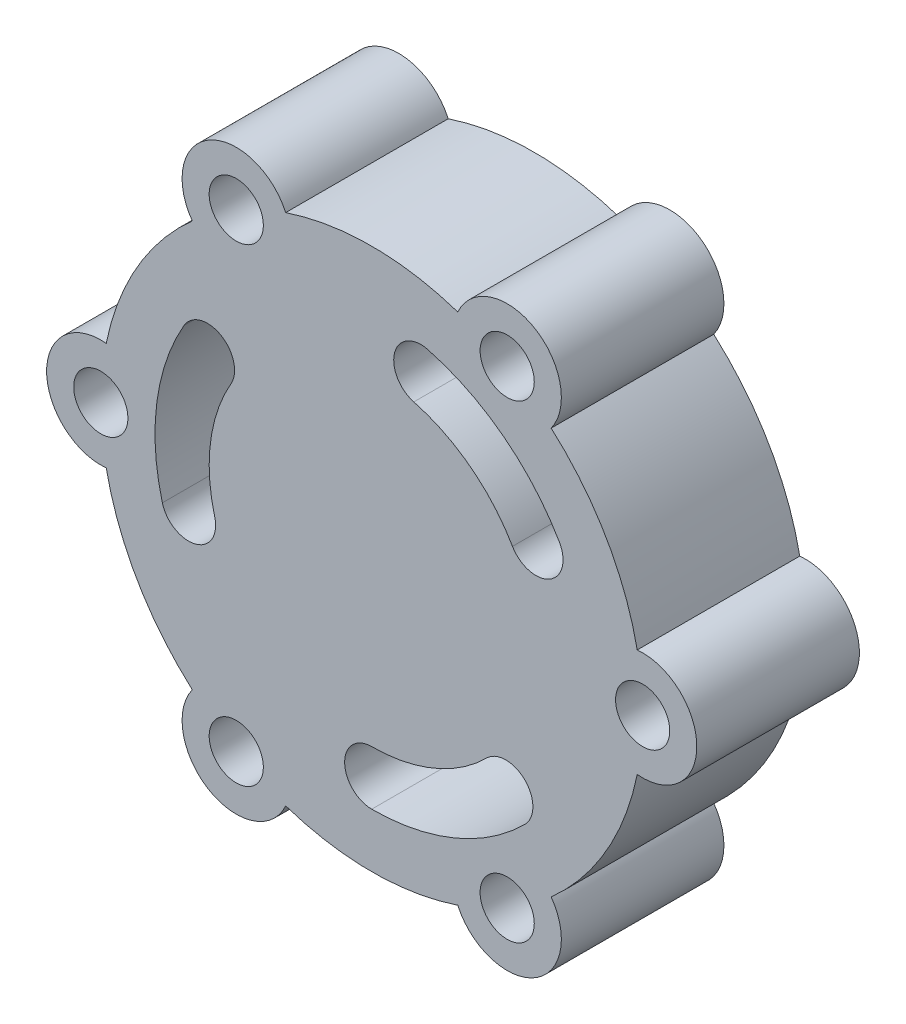
ISO-10303-21;
HEADER;
FILE_DESCRIPTION(('STEP AP214'),'2;1');
FILE_NAME('part.step','',(''),(''),'','','');
FILE_SCHEMA(('AUTOMOTIVE_DESIGN { 1 0 10303 214 1 1 1 1 }'));
ENDSEC;
DATA;
#1=APPLICATION_CONTEXT('core data for automotive mechanical design processes');
#2=APPLICATION_PROTOCOL_DEFINITION('international standard','automotive_design',2000,#1);
#3=PRODUCT_CONTEXT('',#1,'mechanical');
#4=PRODUCT('Part','Part','',(#3));
#5=PRODUCT_RELATED_PRODUCT_CATEGORY('part','',(#4));
#6=PRODUCT_DEFINITION_FORMATION('','',#4);
#7=PRODUCT_DEFINITION_CONTEXT('part definition',#1,'design');
#8=PRODUCT_DEFINITION('design','',#6,#7);
#9=PRODUCT_DEFINITION_SHAPE('','',#8);
#10=(LENGTH_UNIT() NAMED_UNIT(*) SI_UNIT(.MILLI.,.METRE.));
#11=(NAMED_UNIT(*) PLANE_ANGLE_UNIT() SI_UNIT($,.RADIAN.));
#12=(NAMED_UNIT(*) SI_UNIT($,.STERADIAN.) SOLID_ANGLE_UNIT());
#13=UNCERTAINTY_MEASURE_WITH_UNIT(LENGTH_MEASURE(1.E-05),#10,'distance_accuracy_value','');
#14=(GEOMETRIC_REPRESENTATION_CONTEXT(3) GLOBAL_UNCERTAINTY_ASSIGNED_CONTEXT((#13)) GLOBAL_UNIT_ASSIGNED_CONTEXT((#10,
#11,#12)) REPRESENTATION_CONTEXT('',''));
#15=CARTESIAN_POINT('',(0.,0.,0.));
#16=DIRECTION('',(0.,0.,1.));
#17=DIRECTION('',(1.,0.,0.));
#18=AXIS2_PLACEMENT_3D('',#15,#16,#17);
#19=CARTESIAN_POINT('',(45.,70.,30.));
#20=DIRECTION('',(0.,0.,1.));
#21=DIRECTION('',(1.,0.,0.));
#22=AXIS2_PLACEMENT_3D('',#19,#20,#21);
#23=PLANE('',#22);
#24=CARTESIAN_POINT('',(94.9999999999996,113.301270189222,30.));
#25=DIRECTION('',(0.,0.,1.));
#26=DIRECTION('',(1.,0.,0.));
#27=AXIS2_PLACEMENT_3D('',#24,#25,#26);
#28=CIRCLE('',#27,5.);
#29=CARTESIAN_POINT('',(99.9999999999996,113.301270189222,30.));
#30=VERTEX_POINT('',#29);
#31=EDGE_CURVE('E298',#30,#30,#28,.T.);
#32=ORIENTED_EDGE('',*,*,#31,.F.);
#33=EDGE_LOOP('',(#32));
#34=FACE_BOUND('',#33,.T.);
#35=CARTESIAN_POINT('',(95.0000000000002,26.6987298107782,30.));
#36=DIRECTION('',(0.,0.,1.));
#37=DIRECTION('',(1.,0.,0.));
#38=AXIS2_PLACEMENT_3D('',#35,#36,#37);
#39=CIRCLE('',#38,5.);
#40=CARTESIAN_POINT('',(100.,26.6987298107782,30.));
#41=VERTEX_POINT('',#40);
#42=EDGE_CURVE('E310',#41,#41,#39,.T.);
#43=ORIENTED_EDGE('',*,*,#42,.F.);
#44=EDGE_LOOP('',(#43));
#45=FACE_BOUND('',#44,.T.);
#46=CARTESIAN_POINT('',(20.,70.,30.));
#47=DIRECTION('',(0.,0.,1.));
#48=DIRECTION('',(1.,0.,0.));
#49=AXIS2_PLACEMENT_3D('',#46,#47,#48);
#50=CIRCLE('',#49,5.00000000000002);
#51=CARTESIAN_POINT('',(25.,70.,30.));
#52=VERTEX_POINT('',#51);
#53=EDGE_CURVE('E322',#52,#52,#50,.T.);
#54=ORIENTED_EDGE('',*,*,#53,.F.);
#55=EDGE_LOOP('',(#54));
#56=FACE_BOUND('',#55,.T.);
#57=CARTESIAN_POINT('',(20.,70.,30.));
#58=DIRECTION('',(0.,0.,1.));
#59=DIRECTION('',(1.,0.,0.));
#60=AXIS2_PLACEMENT_3D('',#57,#58,#59);
#61=CIRCLE('',#60,10.);
#62=CARTESIAN_POINT('',(21.,79.9498743710662,30.));
#63=VERTEX_POINT('',#62);
#64=CARTESIAN_POINT('',(21.,60.0501256289338,30.));
#65=VERTEX_POINT('',#64);
#66=EDGE_CURVE('E328',#63,#65,#61,.T.);
#67=ORIENTED_EDGE('',*,*,#66,.T.);
#68=CARTESIAN_POINT('',(70.,70.,30.));
#69=DIRECTION('',(0.,0.,1.));
#70=DIRECTION('',(1.,0.,0.));
#71=AXIS2_PLACEMENT_3D('',#68,#69,#70);
#72=CIRCLE('',#71,50.);
#73=CARTESIAN_POINT('',(36.883156030193,32.5396924000955,30.));
#74=VERTEX_POINT('',#73);
#75=EDGE_CURVE('E331',#65,#74,#72,.T.);
#76=ORIENTED_EDGE('',*,*,#75,.T.);
#77=CARTESIAN_POINT('',(45.,26.6987298107781,30.));
#78=DIRECTION('',(0.,0.,1.));
#79=DIRECTION('',(1.,0.,0.));
#80=AXIS2_PLACEMENT_3D('',#77,#78,#79);
#81=CIRCLE('',#80,10.);
#82=CARTESIAN_POINT('',(54.116843969807,22.5898180290294,30.));
#83=VERTEX_POINT('',#82);
#84=EDGE_CURVE('E334',#74,#83,#81,.T.);
#85=ORIENTED_EDGE('',*,*,#84,.T.);
#86=CARTESIAN_POINT('',(70.,70.,30.));
#87=DIRECTION('',(0.,0.,1.));
#88=DIRECTION('',(1.,0.,0.));
#89=AXIS2_PLACEMENT_3D('',#86,#87,#88);
#90=CIRCLE('',#89,50.);
#91=CARTESIAN_POINT('',(85.8831560301931,22.5898180290295,30.));
#92=VERTEX_POINT('',#91);
#93=EDGE_CURVE('E336',#83,#92,#90,.T.);
#94=ORIENTED_EDGE('',*,*,#93,.T.);
#95=CARTESIAN_POINT('',(95.0000000000002,26.6987298107782,30.));
#96=DIRECTION('',(0.,0.,1.));
#97=DIRECTION('',(1.,0.,0.));
#98=AXIS2_PLACEMENT_3D('',#95,#96,#97);
#99=CIRCLE('',#98,10.);
#100=CARTESIAN_POINT('',(103.116843969807,32.5396924000958,30.));
#101=VERTEX_POINT('',#100);
#102=EDGE_CURVE('E338',#92,#101,#99,.T.);
#103=ORIENTED_EDGE('',*,*,#102,.T.);
#104=CARTESIAN_POINT('',(70.,70.,30.));
#105=DIRECTION('',(0.,0.,1.));
#106=DIRECTION('',(1.,0.,0.));
#107=AXIS2_PLACEMENT_3D('',#104,#105,#106);
#108=CIRCLE('',#107,50.);
#109=CARTESIAN_POINT('',(119.,60.0501256289342,30.));
#110=VERTEX_POINT('',#109);
#111=EDGE_CURVE('E340',#101,#110,#108,.T.);
#112=ORIENTED_EDGE('',*,*,#111,.T.);
#113=CARTESIAN_POINT('',(120.,70.0000000000004,30.));
#114=DIRECTION('',(0.,0.,1.));
#115=DIRECTION('',(1.,0.,0.));
#116=AXIS2_PLACEMENT_3D('',#113,#114,#115);
#117=CIRCLE('',#116,10.);
#118=CARTESIAN_POINT('',(119.,79.9498743710666,30.));
#119=VERTEX_POINT('',#118);
#120=EDGE_CURVE('E342',#110,#119,#117,.T.);
#121=ORIENTED_EDGE('',*,*,#120,.T.);
#122=CARTESIAN_POINT('',(70.,70.,30.));
#123=DIRECTION('',(0.,0.,1.));
#124=DIRECTION('',(1.,0.,0.));
#125=AXIS2_PLACEMENT_3D('',#122,#123,#124);
#126=CIRCLE('',#125,50.);
#127=CARTESIAN_POINT('',(103.116843969807,107.460307599905,30.));
#128=VERTEX_POINT('',#127);
#129=EDGE_CURVE('E344',#119,#128,#126,.T.);
#130=ORIENTED_EDGE('',*,*,#129,.T.);
#131=CARTESIAN_POINT('',(94.9999999999996,113.301270189222,30.));
#132=DIRECTION('',(0.,0.,1.));
#133=DIRECTION('',(1.,0.,0.));
#134=AXIS2_PLACEMENT_3D('',#131,#132,#133);
#135=CIRCLE('',#134,10.);
#136=CARTESIAN_POINT('',(85.8831560301925,117.410181970971,30.));
#137=VERTEX_POINT('',#136);
#138=EDGE_CURVE('E346',#128,#137,#135,.T.);
#139=ORIENTED_EDGE('',*,*,#138,.T.);
#140=CARTESIAN_POINT('',(70.,70.,30.));
#141=DIRECTION('',(0.,0.,1.));
#142=DIRECTION('',(1.,0.,0.));
#143=AXIS2_PLACEMENT_3D('',#140,#141,#142);
#144=CIRCLE('',#143,50.);
#145=CARTESIAN_POINT('',(54.1168439698065,117.41018197097,30.));
#146=VERTEX_POINT('',#145);
#147=EDGE_CURVE('E348',#137,#146,#144,.T.);
#148=ORIENTED_EDGE('',*,*,#147,.T.);
#149=CARTESIAN_POINT('',(44.9999999999995,113.301270189222,30.));
#150=DIRECTION('',(0.,0.,1.));
#151=DIRECTION('',(1.,0.,0.));
#152=AXIS2_PLACEMENT_3D('',#149,#150,#151);
#153=CIRCLE('',#152,10.);
#154=CARTESIAN_POINT('',(36.8831560301925,107.460307599904,30.));
#155=VERTEX_POINT('',#154);
#156=EDGE_CURVE('E350',#146,#155,#153,.T.);
#157=ORIENTED_EDGE('',*,*,#156,.T.);
#158=CARTESIAN_POINT('',(70.,70.,30.));
#159=DIRECTION('',(0.,0.,1.));
#160=DIRECTION('',(1.,0.,0.));
#161=AXIS2_PLACEMENT_3D('',#158,#159,#160);
#162=CIRCLE('',#161,50.);
#163=EDGE_CURVE('E352',#155,#63,#162,.T.);
#164=ORIENTED_EDGE('',*,*,#163,.T.);
#165=EDGE_LOOP('',(#67,#76,#85,#94,#103,#112,#121,#130,#139,#148,#157,#164));
#166=FACE_BOUND('',#165,.T.);
#167=CARTESIAN_POINT('',(45.,26.6987298107781,30.));
#168=DIRECTION('',(0.,0.,1.));
#169=DIRECTION('',(1.,0.,0.));
#170=AXIS2_PLACEMENT_3D('',#167,#168,#169);
#171=CIRCLE('',#170,4.99999999999998);
#172=CARTESIAN_POINT('',(50.,26.6987298107781,30.));
#173=VERTEX_POINT('',#172);
#174=EDGE_CURVE('E316',#173,#173,#171,.T.);
#175=ORIENTED_EDGE('',*,*,#174,.F.);
#176=EDGE_LOOP('',(#175));
#177=FACE_BOUND('',#176,.T.);
#178=CARTESIAN_POINT('',(120.,70.0000000000004,30.));
#179=DIRECTION('',(0.,0.,1.));
#180=DIRECTION('',(1.,0.,0.));
#181=AXIS2_PLACEMENT_3D('',#178,#179,#180);
#182=CIRCLE('',#181,5.);
#183=CARTESIAN_POINT('',(125.,70.0000000000004,30.));
#184=VERTEX_POINT('',#183);
#185=EDGE_CURVE('E304',#184,#184,#182,.T.);
#186=ORIENTED_EDGE('',*,*,#185,.F.);
#187=EDGE_LOOP('',(#186));
#188=FACE_BOUND('',#187,.T.);
#189=CARTESIAN_POINT('',(44.9999999999995,113.301270189222,30.));
#190=DIRECTION('',(0.,0.,1.));
#191=DIRECTION('',(1.,0.,0.));
#192=AXIS2_PLACEMENT_3D('',#189,#190,#191);
#193=CIRCLE('',#192,5.00000000000001);
#194=CARTESIAN_POINT('',(49.9999999999995,113.301270189222,30.));
#195=VERTEX_POINT('',#194);
#196=EDGE_CURVE('E292',#195,#195,#193,.T.);
#197=ORIENTED_EDGE('',*,*,#196,.F.);
#198=EDGE_LOOP('',(#197));
#199=FACE_BOUND('',#198,.T.);
#200=CARTESIAN_POINT('',(70.,70.,30.));
#201=DIRECTION('',(0.,0.,1.));
#202=DIRECTION('',(1.,0.,0.));
#203=AXIS2_PLACEMENT_3D('',#200,#201,#202);
#204=CIRCLE('',#203,40.);
#205=CARTESIAN_POINT('',(104.641016151378,89.9999999999998,30.));
#206=VERTEX_POINT('',#205);
#207=CARTESIAN_POINT('',(80.352761804101,108.637033051563,30.));
#208=VERTEX_POINT('',#207);
#209=EDGE_CURVE('E263',#206,#208,#204,.T.);
#210=ORIENTED_EDGE('',*,*,#209,.F.);
#211=CARTESIAN_POINT('',(100.310889132455,87.4999999999998,30.));
#212=DIRECTION('',(0.,0.,1.));
#213=DIRECTION('',(1.,0.,0.));
#214=AXIS2_PLACEMENT_3D('',#211,#212,#213);
#215=CIRCLE('',#214,5.00000000000001);
#216=CARTESIAN_POINT('',(95.9807621135332,84.9999999999998,30.));
#217=VERTEX_POINT('',#216);
#218=EDGE_CURVE('E261',#217,#206,#215,.T.);
#219=ORIENTED_EDGE('',*,*,#218,.F.);
#220=CARTESIAN_POINT('',(70.,70.,30.));
#221=DIRECTION('',(0.,0.,-1.));
#222=DIRECTION('',(1.,0.,0.));
#223=AXIS2_PLACEMENT_3D('',#220,#221,#222);
#224=CIRCLE('',#223,30.);
#225=CARTESIAN_POINT('',(77.7645713530757,98.977774788672,30.));
#226=VERTEX_POINT('',#225);
#227=EDGE_CURVE('E269',#226,#217,#224,.T.);
#228=ORIENTED_EDGE('',*,*,#227,.F.);
#229=CARTESIAN_POINT('',(79.0586665785884,103.807403920117,30.));
#230=DIRECTION('',(0.,0.,1.));
#231=DIRECTION('',(1.,0.,0.));
#232=AXIS2_PLACEMENT_3D('',#229,#230,#231);
#233=CIRCLE('',#232,5.);
#234=EDGE_CURVE('E266',#208,#226,#233,.T.);
#235=ORIENTED_EDGE('',*,*,#234,.F.);
#236=EDGE_LOOP('',(#210,#219,#228,#235));
#237=FACE_BOUND('',#236,.T.);
#238=CARTESIAN_POINT('',(70.,70.,30.));
#239=DIRECTION('',(0.,0.,1.));
#240=DIRECTION('',(1.,0.,0.));
#241=AXIS2_PLACEMENT_3D('',#238,#239,#240);
#242=CIRCLE('',#241,40.);
#243=CARTESIAN_POINT('',(69.9999999999998,30.,30.));
#244=VERTEX_POINT('',#243);
#245=CARTESIAN_POINT('',(98.2842712474617,41.7157287525379,30.));
#246=VERTEX_POINT('',#245);
#247=EDGE_CURVE('E232',#244,#246,#242,.T.);
#248=ORIENTED_EDGE('',*,*,#247,.F.);
#249=CARTESIAN_POINT('',(69.9999999999998,35.,30.));
#250=DIRECTION('',(0.,0.,1.));
#251=DIRECTION('',(1.,0.,0.));
#252=AXIS2_PLACEMENT_3D('',#249,#250,#251);
#253=CIRCLE('',#252,5.);
#254=CARTESIAN_POINT('',(69.9999999999998,40.,30.));
#255=VERTEX_POINT('',#254);
#256=EDGE_CURVE('E230',#255,#244,#253,.T.);
#257=ORIENTED_EDGE('',*,*,#256,.F.);
#258=CARTESIAN_POINT('',(70.,70.,30.));
#259=DIRECTION('',(0.,0.,-1.));
#260=DIRECTION('',(1.,0.,0.));
#261=AXIS2_PLACEMENT_3D('',#258,#259,#260);
#262=CIRCLE('',#261,30.);
#263=CARTESIAN_POINT('',(91.2132034355963,48.7867965644035,30.));
#264=VERTEX_POINT('',#263);
#265=EDGE_CURVE('E238',#264,#255,#262,.T.);
#266=ORIENTED_EDGE('',*,*,#265,.F.);
#267=CARTESIAN_POINT('',(94.748737341529,45.2512626584707,30.));
#268=DIRECTION('',(0.,0.,1.));
#269=DIRECTION('',(1.,0.,0.));
#270=AXIS2_PLACEMENT_3D('',#267,#268,#269);
#271=CIRCLE('',#270,5.);
#272=EDGE_CURVE('E235',#246,#264,#271,.T.);
#273=ORIENTED_EDGE('',*,*,#272,.F.);
#274=EDGE_LOOP('',(#248,#257,#266,#273));
#275=FACE_BOUND('',#274,.T.);
#276=CARTESIAN_POINT('',(70.,70.,30.));
#277=DIRECTION('',(0.,0.,1.));
#278=DIRECTION('',(1.,0.,0.));
#279=AXIS2_PLACEMENT_3D('',#276,#277,#278);
#280=CIRCLE('',#279,40.);
#281=CARTESIAN_POINT('',(35.3589838486226,90.0000000000002,30.));
#282=VERTEX_POINT('',#281);
#283=CARTESIAN_POINT('',(31.3629669484372,59.6472381958993,30.));
#284=VERTEX_POINT('',#283);
#285=EDGE_CURVE('E202',#282,#284,#280,.T.);
#286=ORIENTED_EDGE('',*,*,#285,.F.);
#287=CARTESIAN_POINT('',(39.6891108675447,87.5000000000002,30.));
#288=DIRECTION('',(0.,0.,1.));
#289=DIRECTION('',(1.,0.,0.));
#290=AXIS2_PLACEMENT_3D('',#287,#288,#289);
#291=CIRCLE('',#290,5.);
#292=CARTESIAN_POINT('',(44.0192378864669,85.0000000000002,30.));
#293=VERTEX_POINT('',#292);
#294=EDGE_CURVE('E194',#293,#282,#291,.T.);
#295=ORIENTED_EDGE('',*,*,#294,.F.);
#296=CARTESIAN_POINT('',(70.,70.,30.));
#297=DIRECTION('',(0.,0.,-1.));
#298=DIRECTION('',(1.,0.,0.));
#299=AXIS2_PLACEMENT_3D('',#296,#297,#298);
#300=CIRCLE('',#299,30.);
#301=CARTESIAN_POINT('',(41.0222252113279,62.2354286469245,30.));
#302=VERTEX_POINT('',#301);
#303=EDGE_CURVE('E216',#302,#293,#300,.T.);
#304=ORIENTED_EDGE('',*,*,#303,.F.);
#305=CARTESIAN_POINT('',(36.1925960798825,60.9413334214119,30.));
#306=DIRECTION('',(0.,0.,1.));
#307=DIRECTION('',(1.,0.,0.));
#308=AXIS2_PLACEMENT_3D('',#305,#306,#307);
#309=CIRCLE('',#308,5.00000000000001);
#310=EDGE_CURVE('E214',#284,#302,#309,.T.);
#311=ORIENTED_EDGE('',*,*,#310,.F.);
#312=EDGE_LOOP('',(#286,#295,#304,#311));
#313=FACE_BOUND('',#312,.T.);
#314=ADVANCED_FACE('F33',(#34,#45,#56,#166,#177,#188,#199,#237,#275,#313),#23,.T.);
#315=CARTESIAN_POINT('',(45.,70.,0.));
#316=DIRECTION('',(0.,0.,1.));
#317=DIRECTION('',(1.,0.,0.));
#318=AXIS2_PLACEMENT_3D('',#315,#316,#317);
#319=PLANE('',#318);
#320=CARTESIAN_POINT('',(69.9999999999998,35.,0.));
#321=DIRECTION('',(0.,0.,1.));
#322=DIRECTION('',(1.,0.,0.));
#323=AXIS2_PLACEMENT_3D('',#320,#321,#322);
#324=CIRCLE('',#323,5.);
#325=CARTESIAN_POINT('',(69.9999999999998,40.,0.));
#326=VERTEX_POINT('',#325);
#327=CARTESIAN_POINT('',(69.9999999999998,30.,0.));
#328=VERTEX_POINT('',#327);
#329=EDGE_CURVE('E210',#326,#328,#324,.T.);
#330=ORIENTED_EDGE('',*,*,#329,.T.);
#331=CARTESIAN_POINT('',(70.,70.,0.));
#332=DIRECTION('',(0.,0.,1.));
#333=DIRECTION('',(1.,0.,0.));
#334=AXIS2_PLACEMENT_3D('',#331,#332,#333);
#335=CIRCLE('',#334,40.);
#336=CARTESIAN_POINT('',(98.2842712474617,41.7157287525379,0.));
#337=VERTEX_POINT('',#336);
#338=EDGE_CURVE('E243',#328,#337,#335,.T.);
#339=ORIENTED_EDGE('',*,*,#338,.T.);
#340=CARTESIAN_POINT('',(94.748737341529,45.2512626584707,0.));
#341=DIRECTION('',(0.,0.,1.));
#342=DIRECTION('',(1.,0.,0.));
#343=AXIS2_PLACEMENT_3D('',#340,#341,#342);
#344=CIRCLE('',#343,5.);
#345=CARTESIAN_POINT('',(91.2132034355963,48.7867965644035,0.));
#346=VERTEX_POINT('',#345);
#347=EDGE_CURVE('E246',#337,#346,#344,.T.);
#348=ORIENTED_EDGE('',*,*,#347,.T.);
#349=CARTESIAN_POINT('',(70.,70.,0.));
#350=DIRECTION('',(0.,0.,-1.));
#351=DIRECTION('',(1.,0.,0.));
#352=AXIS2_PLACEMENT_3D('',#349,#350,#351);
#353=CIRCLE('',#352,30.);
#354=EDGE_CURVE('E233',#346,#326,#353,.T.);
#355=ORIENTED_EDGE('',*,*,#354,.T.);
#356=EDGE_LOOP('',(#330,#339,#348,#355));
#357=FACE_BOUND('',#356,.T.);
#358=CARTESIAN_POINT('',(44.9999999999995,113.301270189222,0.));
#359=DIRECTION('',(0.,0.,1.));
#360=DIRECTION('',(1.,0.,0.));
#361=AXIS2_PLACEMENT_3D('',#358,#359,#360);
#362=CIRCLE('',#361,5.00000000000001);
#363=CARTESIAN_POINT('',(49.9999999999995,113.301270189222,0.));
#364=VERTEX_POINT('',#363);
#365=EDGE_CURVE('E291',#364,#364,#362,.T.);
#366=ORIENTED_EDGE('',*,*,#365,.T.);
#367=EDGE_LOOP('',(#366));
#368=FACE_BOUND('',#367,.T.);
#369=CARTESIAN_POINT('',(94.9999999999996,113.301270189222,0.));
#370=DIRECTION('',(0.,0.,1.));
#371=DIRECTION('',(1.,0.,0.));
#372=AXIS2_PLACEMENT_3D('',#369,#370,#371);
#373=CIRCLE('',#372,5.);
#374=CARTESIAN_POINT('',(99.9999999999996,113.301270189222,0.));
#375=VERTEX_POINT('',#374);
#376=EDGE_CURVE('E295',#375,#375,#373,.T.);
#377=ORIENTED_EDGE('',*,*,#376,.T.);
#378=EDGE_LOOP('',(#377));
#379=FACE_BOUND('',#378,.T.);
#380=CARTESIAN_POINT('',(120.,70.0000000000004,0.));
#381=DIRECTION('',(0.,0.,1.));
#382=DIRECTION('',(1.,0.,0.));
#383=AXIS2_PLACEMENT_3D('',#380,#381,#382);
#384=CIRCLE('',#383,5.);
#385=CARTESIAN_POINT('',(125.,70.0000000000004,0.));
#386=VERTEX_POINT('',#385);
#387=EDGE_CURVE('E301',#386,#386,#384,.T.);
#388=ORIENTED_EDGE('',*,*,#387,.T.);
#389=EDGE_LOOP('',(#388));
#390=FACE_BOUND('',#389,.T.);
#391=CARTESIAN_POINT('',(95.0000000000002,26.6987298107782,0.));
#392=DIRECTION('',(0.,0.,1.));
#393=DIRECTION('',(1.,0.,0.));
#394=AXIS2_PLACEMENT_3D('',#391,#392,#393);
#395=CIRCLE('',#394,5.);
#396=CARTESIAN_POINT('',(100.,26.6987298107782,0.));
#397=VERTEX_POINT('',#396);
#398=EDGE_CURVE('E307',#397,#397,#395,.T.);
#399=ORIENTED_EDGE('',*,*,#398,.T.);
#400=EDGE_LOOP('',(#399));
#401=FACE_BOUND('',#400,.T.);
#402=CARTESIAN_POINT('',(45.,26.6987298107781,0.));
#403=DIRECTION('',(0.,0.,1.));
#404=DIRECTION('',(1.,0.,0.));
#405=AXIS2_PLACEMENT_3D('',#402,#403,#404);
#406=CIRCLE('',#405,4.99999999999998);
#407=CARTESIAN_POINT('',(50.,26.6987298107781,0.));
#408=VERTEX_POINT('',#407);
#409=EDGE_CURVE('E313',#408,#408,#406,.T.);
#410=ORIENTED_EDGE('',*,*,#409,.T.);
#411=EDGE_LOOP('',(#410));
#412=FACE_BOUND('',#411,.T.);
#413=CARTESIAN_POINT('',(20.,70.,0.));
#414=DIRECTION('',(0.,0.,1.));
#415=DIRECTION('',(1.,0.,0.));
#416=AXIS2_PLACEMENT_3D('',#413,#414,#415);
#417=CIRCLE('',#416,5.00000000000002);
#418=CARTESIAN_POINT('',(25.,70.,0.));
#419=VERTEX_POINT('',#418);
#420=EDGE_CURVE('E319',#419,#419,#417,.T.);
#421=ORIENTED_EDGE('',*,*,#420,.T.);
#422=EDGE_LOOP('',(#421));
#423=FACE_BOUND('',#422,.T.);
#424=CARTESIAN_POINT('',(20.,70.,0.));
#425=DIRECTION('',(0.,0.,1.));
#426=DIRECTION('',(1.,0.,0.));
#427=AXIS2_PLACEMENT_3D('',#424,#425,#426);
#428=CIRCLE('',#427,10.);
#429=CARTESIAN_POINT('',(21.,79.9498743710662,0.));
#430=VERTEX_POINT('',#429);
#431=CARTESIAN_POINT('',(21.,60.0501256289338,0.));
#432=VERTEX_POINT('',#431);
#433=EDGE_CURVE('E325',#430,#432,#428,.T.);
#434=ORIENTED_EDGE('',*,*,#433,.F.);
#435=CARTESIAN_POINT('',(70.,70.,0.));
#436=DIRECTION('',(0.,0.,1.));
#437=DIRECTION('',(1.,0.,0.));
#438=AXIS2_PLACEMENT_3D('',#435,#436,#437);
#439=CIRCLE('',#438,50.);
#440=CARTESIAN_POINT('',(36.8831560301925,107.460307599904,0.));
#441=VERTEX_POINT('',#440);
#442=EDGE_CURVE('E332',#441,#430,#439,.T.);
#443=ORIENTED_EDGE('',*,*,#442,.F.);
#444=CARTESIAN_POINT('',(44.9999999999995,113.301270189222,0.));
#445=DIRECTION('',(0.,0.,1.));
#446=DIRECTION('',(1.,0.,0.));
#447=AXIS2_PLACEMENT_3D('',#444,#445,#446);
#448=CIRCLE('',#447,10.);
#449=CARTESIAN_POINT('',(54.1168439698065,117.41018197097,0.));
#450=VERTEX_POINT('',#449);
#451=EDGE_CURVE('E375',#450,#441,#448,.T.);
#452=ORIENTED_EDGE('',*,*,#451,.F.);
#453=CARTESIAN_POINT('',(70.,70.,0.));
#454=DIRECTION('',(0.,0.,1.));
#455=DIRECTION('',(1.,0.,0.));
#456=AXIS2_PLACEMENT_3D('',#453,#454,#455);
#457=CIRCLE('',#456,50.);
#458=CARTESIAN_POINT('',(85.8831560301925,117.410181970971,0.));
#459=VERTEX_POINT('',#458);
#460=EDGE_CURVE('E373',#459,#450,#457,.T.);
#461=ORIENTED_EDGE('',*,*,#460,.F.);
#462=CARTESIAN_POINT('',(94.9999999999996,113.301270189222,0.));
#463=DIRECTION('',(0.,0.,1.));
#464=DIRECTION('',(1.,0.,0.));
#465=AXIS2_PLACEMENT_3D('',#462,#463,#464);
#466=CIRCLE('',#465,10.);
#467=CARTESIAN_POINT('',(103.116843969807,107.460307599905,0.));
#468=VERTEX_POINT('',#467);
#469=EDGE_CURVE('E371',#468,#459,#466,.T.);
#470=ORIENTED_EDGE('',*,*,#469,.F.);
#471=CARTESIAN_POINT('',(70.,70.,0.));
#472=DIRECTION('',(0.,0.,1.));
#473=DIRECTION('',(1.,0.,0.));
#474=AXIS2_PLACEMENT_3D('',#471,#472,#473);
#475=CIRCLE('',#474,50.);
#476=CARTESIAN_POINT('',(119.,79.9498743710666,0.));
#477=VERTEX_POINT('',#476);
#478=EDGE_CURVE('E369',#477,#468,#475,.T.);
#479=ORIENTED_EDGE('',*,*,#478,.F.);
#480=CARTESIAN_POINT('',(120.,70.0000000000004,0.));
#481=DIRECTION('',(0.,0.,1.));
#482=DIRECTION('',(1.,0.,0.));
#483=AXIS2_PLACEMENT_3D('',#480,#481,#482);
#484=CIRCLE('',#483,10.);
#485=CARTESIAN_POINT('',(119.,60.0501256289342,0.));
#486=VERTEX_POINT('',#485);
#487=EDGE_CURVE('E367',#486,#477,#484,.T.);
#488=ORIENTED_EDGE('',*,*,#487,.F.);
#489=CARTESIAN_POINT('',(70.,70.,0.));
#490=DIRECTION('',(0.,0.,1.));
#491=DIRECTION('',(1.,0.,0.));
#492=AXIS2_PLACEMENT_3D('',#489,#490,#491);
#493=CIRCLE('',#492,50.);
#494=CARTESIAN_POINT('',(103.116843969807,32.5396924000958,0.));
#495=VERTEX_POINT('',#494);
#496=EDGE_CURVE('E365',#495,#486,#493,.T.);
#497=ORIENTED_EDGE('',*,*,#496,.F.);
#498=CARTESIAN_POINT('',(95.0000000000002,26.6987298107782,0.));
#499=DIRECTION('',(0.,0.,1.));
#500=DIRECTION('',(1.,0.,0.));
#501=AXIS2_PLACEMENT_3D('',#498,#499,#500);
#502=CIRCLE('',#501,10.);
#503=CARTESIAN_POINT('',(85.8831560301931,22.5898180290295,0.));
#504=VERTEX_POINT('',#503);
#505=EDGE_CURVE('E363',#504,#495,#502,.T.);
#506=ORIENTED_EDGE('',*,*,#505,.F.);
#507=CARTESIAN_POINT('',(70.,70.,0.));
#508=DIRECTION('',(0.,0.,1.));
#509=DIRECTION('',(1.,0.,0.));
#510=AXIS2_PLACEMENT_3D('',#507,#508,#509);
#511=CIRCLE('',#510,50.);
#512=CARTESIAN_POINT('',(54.116843969807,22.5898180290294,0.));
#513=VERTEX_POINT('',#512);
#514=EDGE_CURVE('E361',#513,#504,#511,.T.);
#515=ORIENTED_EDGE('',*,*,#514,.F.);
#516=CARTESIAN_POINT('',(45.,26.6987298107781,0.));
#517=DIRECTION('',(0.,0.,1.));
#518=DIRECTION('',(1.,0.,0.));
#519=AXIS2_PLACEMENT_3D('',#516,#517,#518);
#520=CIRCLE('',#519,10.);
#521=CARTESIAN_POINT('',(36.883156030193,32.5396924000955,0.));
#522=VERTEX_POINT('',#521);
#523=EDGE_CURVE('E359',#522,#513,#520,.T.);
#524=ORIENTED_EDGE('',*,*,#523,.F.);
#525=CARTESIAN_POINT('',(70.,70.,0.));
#526=DIRECTION('',(0.,0.,1.));
#527=DIRECTION('',(1.,0.,0.));
#528=AXIS2_PLACEMENT_3D('',#525,#526,#527);
#529=CIRCLE('',#528,50.);
#530=EDGE_CURVE('E357',#432,#522,#529,.T.);
#531=ORIENTED_EDGE('',*,*,#530,.F.);
#532=EDGE_LOOP('',(#434,#443,#452,#461,#470,#479,#488,#497,#506,#515,#524,#531));
#533=FACE_BOUND('',#532,.T.);
#534=CARTESIAN_POINT('',(100.310889132455,87.4999999999998,0.));
#535=DIRECTION('',(0.,0.,1.));
#536=DIRECTION('',(1.,0.,0.));
#537=AXIS2_PLACEMENT_3D('',#534,#535,#536);
#538=CIRCLE('',#537,5.00000000000001);
#539=CARTESIAN_POINT('',(95.9807621135332,84.9999999999998,0.));
#540=VERTEX_POINT('',#539);
#541=CARTESIAN_POINT('',(104.641016151378,89.9999999999998,0.));
#542=VERTEX_POINT('',#541);
#543=EDGE_CURVE('E260',#540,#542,#538,.T.);
#544=ORIENTED_EDGE('',*,*,#543,.T.);
#545=CARTESIAN_POINT('',(70.,70.,0.));
#546=DIRECTION('',(0.,0.,1.));
#547=DIRECTION('',(1.,0.,0.));
#548=AXIS2_PLACEMENT_3D('',#545,#546,#547);
#549=CIRCLE('',#548,40.);
#550=CARTESIAN_POINT('',(80.352761804101,108.637033051563,0.));
#551=VERTEX_POINT('',#550);
#552=EDGE_CURVE('E274',#542,#551,#549,.T.);
#553=ORIENTED_EDGE('',*,*,#552,.T.);
#554=CARTESIAN_POINT('',(79.0586665785884,103.807403920117,0.));
#555=DIRECTION('',(0.,0.,1.));
#556=DIRECTION('',(1.,0.,0.));
#557=AXIS2_PLACEMENT_3D('',#554,#555,#556);
#558=CIRCLE('',#557,5.);
#559=CARTESIAN_POINT('',(77.7645713530757,98.977774788672,0.));
#560=VERTEX_POINT('',#559);
#561=EDGE_CURVE('E277',#551,#560,#558,.T.);
#562=ORIENTED_EDGE('',*,*,#561,.T.);
#563=CARTESIAN_POINT('',(70.,70.,0.));
#564=DIRECTION('',(0.,0.,-1.));
#565=DIRECTION('',(1.,0.,0.));
#566=AXIS2_PLACEMENT_3D('',#563,#564,#565);
#567=CIRCLE('',#566,30.);
#568=EDGE_CURVE('E264',#560,#540,#567,.T.);
#569=ORIENTED_EDGE('',*,*,#568,.T.);
#570=EDGE_LOOP('',(#544,#553,#562,#569));
#571=FACE_BOUND('',#570,.T.);
#572=CARTESIAN_POINT('',(39.6891108675447,87.5000000000002,0.));
#573=DIRECTION('',(0.,0.,1.));
#574=DIRECTION('',(1.,0.,0.));
#575=AXIS2_PLACEMENT_3D('',#572,#573,#574);
#576=CIRCLE('',#575,5.);
#577=CARTESIAN_POINT('',(44.0192378864669,85.0000000000002,0.));
#578=VERTEX_POINT('',#577);
#579=CARTESIAN_POINT('',(35.3589838486226,90.0000000000002,0.));
#580=VERTEX_POINT('',#579);
#581=EDGE_CURVE('E56',#578,#580,#576,.T.);
#582=ORIENTED_EDGE('',*,*,#581,.T.);
#583=CARTESIAN_POINT('',(70.,70.,0.));
#584=DIRECTION('',(0.,0.,1.));
#585=DIRECTION('',(1.,0.,0.));
#586=AXIS2_PLACEMENT_3D('',#583,#584,#585);
#587=CIRCLE('',#586,40.);
#588=CARTESIAN_POINT('',(31.3629669484372,59.6472381958993,0.));
#589=VERTEX_POINT('',#588);
#590=EDGE_CURVE('E209',#580,#589,#587,.T.);
#591=ORIENTED_EDGE('',*,*,#590,.T.);
#592=CARTESIAN_POINT('',(36.1925960798825,60.9413334214119,0.));
#593=DIRECTION('',(0.,0.,1.));
#594=DIRECTION('',(1.,0.,0.));
#595=AXIS2_PLACEMENT_3D('',#592,#593,#594);
#596=CIRCLE('',#595,5.00000000000001);
#597=CARTESIAN_POINT('',(41.0222252113279,62.2354286469245,0.));
#598=VERTEX_POINT('',#597);
#599=EDGE_CURVE('E222',#589,#598,#596,.T.);
#600=ORIENTED_EDGE('',*,*,#599,.T.);
#601=CARTESIAN_POINT('',(70.,70.,0.));
#602=DIRECTION('',(0.,0.,-1.));
#603=DIRECTION('',(1.,0.,0.));
#604=AXIS2_PLACEMENT_3D('',#601,#602,#603);
#605=CIRCLE('',#604,30.);
#606=EDGE_CURVE('E203',#598,#578,#605,.T.);
#607=ORIENTED_EDGE('',*,*,#606,.T.);
#608=EDGE_LOOP('',(#582,#591,#600,#607));
#609=FACE_BOUND('',#608,.T.);
#610=ADVANCED_FACE('F417',(#357,#368,#379,#390,#401,#412,#423,#533,#571,#609),#319,.F.);
#611=CARTESIAN_POINT('',(20.,70.,30.));
#612=DIRECTION('',(0.,0.,-1.));
#613=DIRECTION('',(-1.,0.,0.));
#614=AXIS2_PLACEMENT_3D('',#611,#612,#613);
#615=CYLINDRICAL_SURFACE('',#614,10.);
#616=ORIENTED_EDGE('',*,*,#433,.T.);
#617=DIRECTION('',(0.,0.,-1.));
#618=VECTOR('',#617,1.);
#619=CARTESIAN_POINT('',(21.,60.0501256289338,30.));
#620=LINE('',#619,#618);
#621=EDGE_CURVE('E11',#65,#432,#620,.T.);
#622=ORIENTED_EDGE('',*,*,#621,.F.);
#623=ORIENTED_EDGE('',*,*,#66,.F.);
#624=DIRECTION('',(0.,0.,-1.));
#625=VECTOR('',#624,1.);
#626=CARTESIAN_POINT('',(21.,79.9498743710662,30.));
#627=LINE('',#626,#625);
#628=EDGE_CURVE('E354',#63,#430,#627,.T.);
#629=ORIENTED_EDGE('',*,*,#628,.T.);
#630=EDGE_LOOP('',(#616,#622,#623,#629));
#631=FACE_BOUND('',#630,.T.);
#632=ADVANCED_FACE('F35',(#631),#615,.T.);
#633=CARTESIAN_POINT('',(70.,70.,30.));
#634=DIRECTION('',(0.,0.,-1.));
#635=DIRECTION('',(-1.,0.,0.));
#636=AXIS2_PLACEMENT_3D('',#633,#634,#635);
#637=CYLINDRICAL_SURFACE('',#636,50.);
#638=ORIENTED_EDGE('',*,*,#530,.T.);
#639=DIRECTION('',(0.,0.,-1.));
#640=VECTOR('',#639,1.);
#641=CARTESIAN_POINT('',(36.883156030193,32.5396924000955,30.));
#642=LINE('',#641,#640);
#643=EDGE_CURVE('E41',#74,#522,#642,.T.);
#644=ORIENTED_EDGE('',*,*,#643,.F.);
#645=ORIENTED_EDGE('',*,*,#75,.F.);
#646=ORIENTED_EDGE('',*,*,#621,.T.);
#647=EDGE_LOOP('',(#638,#644,#645,#646));
#648=FACE_BOUND('',#647,.T.);
#649=ADVANCED_FACE('F435',(#648),#637,.T.);
#650=CARTESIAN_POINT('',(45.,26.6987298107781,30.));
#651=DIRECTION('',(0.,0.,-1.));
#652=DIRECTION('',(-1.,0.,0.));
#653=AXIS2_PLACEMENT_3D('',#650,#651,#652);
#654=CYLINDRICAL_SURFACE('',#653,10.);
#655=ORIENTED_EDGE('',*,*,#523,.T.);
#656=DIRECTION('',(0.,0.,-1.));
#657=VECTOR('',#656,1.);
#658=CARTESIAN_POINT('',(54.116843969807,22.5898180290294,30.));
#659=LINE('',#658,#657);
#660=EDGE_CURVE('E404',#83,#513,#659,.T.);
#661=ORIENTED_EDGE('',*,*,#660,.F.);
#662=ORIENTED_EDGE('',*,*,#84,.F.);
#663=ORIENTED_EDGE('',*,*,#643,.T.);
#664=EDGE_LOOP('',(#655,#661,#662,#663));
#665=FACE_BOUND('',#664,.T.);
#666=ADVANCED_FACE('F411',(#665),#654,.T.);
#667=CARTESIAN_POINT('',(70.,70.,30.));
#668=DIRECTION('',(0.,0.,-1.));
#669=DIRECTION('',(-1.,0.,0.));
#670=AXIS2_PLACEMENT_3D('',#667,#668,#669);
#671=CYLINDRICAL_SURFACE('',#670,50.);
#672=ORIENTED_EDGE('',*,*,#514,.T.);
#673=DIRECTION('',(0.,0.,-1.));
#674=VECTOR('',#673,1.);
#675=CARTESIAN_POINT('',(85.8831560301931,22.5898180290295,30.));
#676=LINE('',#675,#674);
#677=EDGE_CURVE('E401',#92,#504,#676,.T.);
#678=ORIENTED_EDGE('',*,*,#677,.F.);
#679=ORIENTED_EDGE('',*,*,#93,.F.);
#680=ORIENTED_EDGE('',*,*,#660,.T.);
#681=EDGE_LOOP('',(#672,#678,#679,#680));
#682=FACE_BOUND('',#681,.T.);
#683=ADVANCED_FACE('F423',(#682),#671,.T.);
#684=CARTESIAN_POINT('',(95.0000000000002,26.6987298107782,30.));
#685=DIRECTION('',(0.,0.,-1.));
#686=DIRECTION('',(-1.,0.,0.));
#687=AXIS2_PLACEMENT_3D('',#684,#685,#686);
#688=CYLINDRICAL_SURFACE('',#687,10.);
#689=ORIENTED_EDGE('',*,*,#505,.T.);
#690=DIRECTION('',(0.,0.,-1.));
#691=VECTOR('',#690,1.);
#692=CARTESIAN_POINT('',(103.116843969807,32.5396924000958,30.));
#693=LINE('',#692,#691);
#694=EDGE_CURVE('E398',#101,#495,#693,.T.);
#695=ORIENTED_EDGE('',*,*,#694,.F.);
#696=ORIENTED_EDGE('',*,*,#102,.F.);
#697=ORIENTED_EDGE('',*,*,#677,.T.);
#698=EDGE_LOOP('',(#689,#695,#696,#697));
#699=FACE_BOUND('',#698,.T.);
#700=ADVANCED_FACE('F427',(#699),#688,.T.);
#701=CARTESIAN_POINT('',(70.,70.,30.));
#702=DIRECTION('',(0.,0.,-1.));
#703=DIRECTION('',(-1.,0.,0.));
#704=AXIS2_PLACEMENT_3D('',#701,#702,#703);
#705=CYLINDRICAL_SURFACE('',#704,50.);
#706=ORIENTED_EDGE('',*,*,#496,.T.);
#707=DIRECTION('',(0.,0.,-1.));
#708=VECTOR('',#707,1.);
#709=CARTESIAN_POINT('',(119.,60.0501256289342,30.));
#710=LINE('',#709,#708);
#711=EDGE_CURVE('E395',#110,#486,#710,.T.);
#712=ORIENTED_EDGE('',*,*,#711,.F.);
#713=ORIENTED_EDGE('',*,*,#111,.F.);
#714=ORIENTED_EDGE('',*,*,#694,.T.);
#715=EDGE_LOOP('',(#706,#712,#713,#714));
#716=FACE_BOUND('',#715,.T.);
#717=ADVANCED_FACE('F468',(#716),#705,.T.);
#718=CARTESIAN_POINT('',(120.,70.0000000000004,30.));
#719=DIRECTION('',(0.,0.,-1.));
#720=DIRECTION('',(-1.,0.,0.));
#721=AXIS2_PLACEMENT_3D('',#718,#719,#720);
#722=CYLINDRICAL_SURFACE('',#721,10.);
#723=ORIENTED_EDGE('',*,*,#487,.T.);
#724=DIRECTION('',(0.,0.,-1.));
#725=VECTOR('',#724,1.);
#726=CARTESIAN_POINT('',(119.,79.9498743710666,30.));
#727=LINE('',#726,#725);
#728=EDGE_CURVE('E392',#119,#477,#727,.T.);
#729=ORIENTED_EDGE('',*,*,#728,.F.);
#730=ORIENTED_EDGE('',*,*,#120,.F.);
#731=ORIENTED_EDGE('',*,*,#711,.T.);
#732=EDGE_LOOP('',(#723,#729,#730,#731));
#733=FACE_BOUND('',#732,.T.);
#734=ADVANCED_FACE('F466',(#733),#722,.T.);
#735=CARTESIAN_POINT('',(70.,70.,30.));
#736=DIRECTION('',(0.,0.,-1.));
#737=DIRECTION('',(-1.,0.,0.));
#738=AXIS2_PLACEMENT_3D('',#735,#736,#737);
#739=CYLINDRICAL_SURFACE('',#738,50.);
#740=ORIENTED_EDGE('',*,*,#478,.T.);
#741=DIRECTION('',(0.,0.,-1.));
#742=VECTOR('',#741,1.);
#743=CARTESIAN_POINT('',(103.116843969807,107.460307599905,30.));
#744=LINE('',#743,#742);
#745=EDGE_CURVE('E389',#128,#468,#744,.T.);
#746=ORIENTED_EDGE('',*,*,#745,.F.);
#747=ORIENTED_EDGE('',*,*,#129,.F.);
#748=ORIENTED_EDGE('',*,*,#728,.T.);
#749=EDGE_LOOP('',(#740,#746,#747,#748));
#750=FACE_BOUND('',#749,.T.);
#751=ADVANCED_FACE('F462',(#750),#739,.T.);
#752=CARTESIAN_POINT('',(94.9999999999996,113.301270189222,30.));
#753=DIRECTION('',(0.,0.,-1.));
#754=DIRECTION('',(-1.,0.,0.));
#755=AXIS2_PLACEMENT_3D('',#752,#753,#754);
#756=CYLINDRICAL_SURFACE('',#755,10.);
#757=ORIENTED_EDGE('',*,*,#469,.T.);
#758=DIRECTION('',(0.,0.,-1.));
#759=VECTOR('',#758,1.);
#760=CARTESIAN_POINT('',(85.8831560301925,117.410181970971,30.));
#761=LINE('',#760,#759);
#762=EDGE_CURVE('E386',#137,#459,#761,.T.);
#763=ORIENTED_EDGE('',*,*,#762,.F.);
#764=ORIENTED_EDGE('',*,*,#138,.F.);
#765=ORIENTED_EDGE('',*,*,#745,.T.);
#766=EDGE_LOOP('',(#757,#763,#764,#765));
#767=FACE_BOUND('',#766,.T.);
#768=ADVANCED_FACE('F457',(#767),#756,.T.);
#769=CARTESIAN_POINT('',(70.,70.,30.));
#770=DIRECTION('',(0.,0.,-1.));
#771=DIRECTION('',(-1.,0.,0.));
#772=AXIS2_PLACEMENT_3D('',#769,#770,#771);
#773=CYLINDRICAL_SURFACE('',#772,50.);
#774=ORIENTED_EDGE('',*,*,#460,.T.);
#775=DIRECTION('',(0.,0.,-1.));
#776=VECTOR('',#775,1.);
#777=CARTESIAN_POINT('',(54.1168439698065,117.41018197097,30.));
#778=LINE('',#777,#776);
#779=EDGE_CURVE('E383',#146,#450,#778,.T.);
#780=ORIENTED_EDGE('',*,*,#779,.F.);
#781=ORIENTED_EDGE('',*,*,#147,.F.);
#782=ORIENTED_EDGE('',*,*,#762,.T.);
#783=EDGE_LOOP('',(#774,#780,#781,#782));
#784=FACE_BOUND('',#783,.T.);
#785=ADVANCED_FACE('F451',(#784),#773,.T.);
#786=CARTESIAN_POINT('',(44.9999999999995,113.301270189222,30.));
#787=DIRECTION('',(0.,0.,-1.));
#788=DIRECTION('',(-1.,0.,0.));
#789=AXIS2_PLACEMENT_3D('',#786,#787,#788);
#790=CYLINDRICAL_SURFACE('',#789,10.);
#791=ORIENTED_EDGE('',*,*,#451,.T.);
#792=DIRECTION('',(0.,0.,-1.));
#793=VECTOR('',#792,1.);
#794=CARTESIAN_POINT('',(36.8831560301925,107.460307599904,30.));
#795=LINE('',#794,#793);
#796=EDGE_CURVE('E380',#155,#441,#795,.T.);
#797=ORIENTED_EDGE('',*,*,#796,.F.);
#798=ORIENTED_EDGE('',*,*,#156,.F.);
#799=ORIENTED_EDGE('',*,*,#779,.T.);
#800=EDGE_LOOP('',(#791,#797,#798,#799));
#801=FACE_BOUND('',#800,.T.);
#802=ADVANCED_FACE('F447',(#801),#790,.T.);
#803=CARTESIAN_POINT('',(70.,70.,30.));
#804=DIRECTION('',(0.,0.,-1.));
#805=DIRECTION('',(-1.,0.,0.));
#806=AXIS2_PLACEMENT_3D('',#803,#804,#805);
#807=CYLINDRICAL_SURFACE('',#806,50.);
#808=ORIENTED_EDGE('',*,*,#442,.T.);
#809=ORIENTED_EDGE('',*,*,#628,.F.);
#810=ORIENTED_EDGE('',*,*,#163,.F.);
#811=ORIENTED_EDGE('',*,*,#796,.T.);
#812=EDGE_LOOP('',(#808,#809,#810,#811));
#813=FACE_BOUND('',#812,.T.);
#814=ADVANCED_FACE('F442',(#813),#807,.T.);
#815=CARTESIAN_POINT('',(20.,70.,30.));
#816=DIRECTION('',(0.,0.,-1.));
#817=DIRECTION('',(-1.,0.,0.));
#818=AXIS2_PLACEMENT_3D('',#815,#816,#817);
#819=CYLINDRICAL_SURFACE('',#818,5.00000000000002);
#820=ORIENTED_EDGE('',*,*,#53,.T.);
#821=EDGE_LOOP('',(#820));
#822=FACE_BOUND('',#821,.T.);
#823=ORIENTED_EDGE('',*,*,#420,.F.);
#824=EDGE_LOOP('',(#823));
#825=FACE_BOUND('',#824,.T.);
#826=ADVANCED_FACE('F488',(#822,#825),#819,.F.);
#827=CARTESIAN_POINT('',(45.,26.6987298107781,30.));
#828=DIRECTION('',(0.,0.,-1.));
#829=DIRECTION('',(-1.,0.,0.));
#830=AXIS2_PLACEMENT_3D('',#827,#828,#829);
#831=CYLINDRICAL_SURFACE('',#830,4.99999999999998);
#832=ORIENTED_EDGE('',*,*,#174,.T.);
#833=EDGE_LOOP('',(#832));
#834=FACE_BOUND('',#833,.T.);
#835=ORIENTED_EDGE('',*,*,#409,.F.);
#836=EDGE_LOOP('',(#835));
#837=FACE_BOUND('',#836,.T.);
#838=ADVANCED_FACE('F526',(#834,#837),#831,.F.);
#839=CARTESIAN_POINT('',(95.0000000000002,26.6987298107782,30.));
#840=DIRECTION('',(0.,0.,-1.));
#841=DIRECTION('',(-1.,0.,0.));
#842=AXIS2_PLACEMENT_3D('',#839,#840,#841);
#843=CYLINDRICAL_SURFACE('',#842,5.);
#844=ORIENTED_EDGE('',*,*,#42,.T.);
#845=EDGE_LOOP('',(#844));
#846=FACE_BOUND('',#845,.T.);
#847=ORIENTED_EDGE('',*,*,#398,.F.);
#848=EDGE_LOOP('',(#847));
#849=FACE_BOUND('',#848,.T.);
#850=ADVANCED_FACE('F533',(#846,#849),#843,.F.);
#851=CARTESIAN_POINT('',(120.,70.0000000000004,30.));
#852=DIRECTION('',(0.,0.,-1.));
#853=DIRECTION('',(-1.,0.,0.));
#854=AXIS2_PLACEMENT_3D('',#851,#852,#853);
#855=CYLINDRICAL_SURFACE('',#854,5.);
#856=ORIENTED_EDGE('',*,*,#185,.T.);
#857=EDGE_LOOP('',(#856));
#858=FACE_BOUND('',#857,.T.);
#859=ORIENTED_EDGE('',*,*,#387,.F.);
#860=EDGE_LOOP('',(#859));
#861=FACE_BOUND('',#860,.T.);
#862=ADVANCED_FACE('F540',(#858,#861),#855,.F.);
#863=CARTESIAN_POINT('',(94.9999999999996,113.301270189222,30.));
#864=DIRECTION('',(0.,0.,-1.));
#865=DIRECTION('',(-1.,0.,0.));
#866=AXIS2_PLACEMENT_3D('',#863,#864,#865);
#867=CYLINDRICAL_SURFACE('',#866,5.);
#868=ORIENTED_EDGE('',*,*,#31,.T.);
#869=EDGE_LOOP('',(#868));
#870=FACE_BOUND('',#869,.T.);
#871=ORIENTED_EDGE('',*,*,#376,.F.);
#872=EDGE_LOOP('',(#871));
#873=FACE_BOUND('',#872,.T.);
#874=ADVANCED_FACE('F548',(#870,#873),#867,.F.);
#875=CARTESIAN_POINT('',(44.9999999999995,113.301270189222,30.));
#876=DIRECTION('',(0.,0.,-1.));
#877=DIRECTION('',(-1.,0.,0.));
#878=AXIS2_PLACEMENT_3D('',#875,#876,#877);
#879=CYLINDRICAL_SURFACE('',#878,5.00000000000001);
#880=ORIENTED_EDGE('',*,*,#196,.T.);
#881=EDGE_LOOP('',(#880));
#882=FACE_BOUND('',#881,.T.);
#883=ORIENTED_EDGE('',*,*,#365,.F.);
#884=EDGE_LOOP('',(#883));
#885=FACE_BOUND('',#884,.T.);
#886=ADVANCED_FACE('F556',(#882,#885),#879,.F.);
#887=CARTESIAN_POINT('',(100.310889132455,87.4999999999998,30.));
#888=DIRECTION('',(0.,0.,-1.));
#889=DIRECTION('',(-1.,0.,0.));
#890=AXIS2_PLACEMENT_3D('',#887,#888,#889);
#891=CYLINDRICAL_SURFACE('',#890,5.00000000000001);
#892=ORIENTED_EDGE('',*,*,#543,.F.);
#893=DIRECTION('',(0.,0.,-1.));
#894=VECTOR('',#893,1.);
#895=CARTESIAN_POINT('',(95.9807621135332,84.9999999999998,30.));
#896=LINE('',#895,#894);
#897=EDGE_CURVE('E271',#217,#540,#896,.T.);
#898=ORIENTED_EDGE('',*,*,#897,.F.);
#899=ORIENTED_EDGE('',*,*,#218,.T.);
#900=DIRECTION('',(0.,0.,-1.));
#901=VECTOR('',#900,1.);
#902=CARTESIAN_POINT('',(104.641016151378,89.9999999999998,30.));
#903=LINE('',#902,#901);
#904=EDGE_CURVE('E288',#206,#542,#903,.T.);
#905=ORIENTED_EDGE('',*,*,#904,.T.);
#906=EDGE_LOOP('',(#892,#898,#899,#905));
#907=FACE_BOUND('',#906,.T.);
#908=ADVANCED_FACE('F564',(#907),#891,.F.);
#909=CARTESIAN_POINT('',(70.,70.,30.));
#910=DIRECTION('',(0.,0.,-1.));
#911=DIRECTION('',(-1.,0.,0.));
#912=AXIS2_PLACEMENT_3D('',#909,#910,#911);
#913=CYLINDRICAL_SURFACE('',#912,40.);
#914=ORIENTED_EDGE('',*,*,#552,.F.);
#915=ORIENTED_EDGE('',*,*,#904,.F.);
#916=ORIENTED_EDGE('',*,*,#209,.T.);
#917=DIRECTION('',(0.,0.,-1.));
#918=VECTOR('',#917,1.);
#919=CARTESIAN_POINT('',(80.352761804101,108.637033051563,30.));
#920=LINE('',#919,#918);
#921=EDGE_CURVE('E286',#208,#551,#920,.T.);
#922=ORIENTED_EDGE('',*,*,#921,.T.);
#923=EDGE_LOOP('',(#914,#915,#916,#922));
#924=FACE_BOUND('',#923,.T.);
#925=ADVANCED_FACE('F572',(#924),#913,.F.);
#926=CARTESIAN_POINT('',(79.0586665785884,103.807403920117,30.));
#927=DIRECTION('',(0.,0.,-1.));
#928=DIRECTION('',(-1.,0.,0.));
#929=AXIS2_PLACEMENT_3D('',#926,#927,#928);
#930=CYLINDRICAL_SURFACE('',#929,5.);
#931=ORIENTED_EDGE('',*,*,#561,.F.);
#932=ORIENTED_EDGE('',*,*,#921,.F.);
#933=ORIENTED_EDGE('',*,*,#234,.T.);
#934=DIRECTION('',(0.,0.,-1.));
#935=VECTOR('',#934,1.);
#936=CARTESIAN_POINT('',(77.7645713530757,98.977774788672,30.));
#937=LINE('',#936,#935);
#938=EDGE_CURVE('E284',#226,#560,#937,.T.);
#939=ORIENTED_EDGE('',*,*,#938,.T.);
#940=EDGE_LOOP('',(#931,#932,#933,#939));
#941=FACE_BOUND('',#940,.T.);
#942=ADVANCED_FACE('F580',(#941),#930,.F.);
#943=CARTESIAN_POINT('',(70.,70.,30.));
#944=DIRECTION('',(0.,0.,-1.));
#945=DIRECTION('',(-1.,0.,0.));
#946=AXIS2_PLACEMENT_3D('',#943,#944,#945);
#947=CYLINDRICAL_SURFACE('',#946,30.);
#948=ORIENTED_EDGE('',*,*,#568,.F.);
#949=ORIENTED_EDGE('',*,*,#938,.F.);
#950=ORIENTED_EDGE('',*,*,#227,.T.);
#951=ORIENTED_EDGE('',*,*,#897,.T.);
#952=EDGE_LOOP('',(#948,#949,#950,#951));
#953=FACE_BOUND('',#952,.T.);
#954=ADVANCED_FACE('F588',(#953),#947,.T.);
#955=CARTESIAN_POINT('',(69.9999999999998,35.,30.));
#956=DIRECTION('',(0.,0.,-1.));
#957=DIRECTION('',(-1.,0.,0.));
#958=AXIS2_PLACEMENT_3D('',#955,#956,#957);
#959=CYLINDRICAL_SURFACE('',#958,5.);
#960=ORIENTED_EDGE('',*,*,#329,.F.);
#961=DIRECTION('',(0.,0.,-1.));
#962=VECTOR('',#961,1.);
#963=CARTESIAN_POINT('',(69.9999999999998,40.,30.));
#964=LINE('',#963,#962);
#965=EDGE_CURVE('E240',#255,#326,#964,.T.);
#966=ORIENTED_EDGE('',*,*,#965,.F.);
#967=ORIENTED_EDGE('',*,*,#256,.T.);
#968=DIRECTION('',(0.,0.,-1.));
#969=VECTOR('',#968,1.);
#970=CARTESIAN_POINT('',(69.9999999999998,30.,30.));
#971=LINE('',#970,#969);
#972=EDGE_CURVE('E257',#244,#328,#971,.T.);
#973=ORIENTED_EDGE('',*,*,#972,.T.);
#974=EDGE_LOOP('',(#960,#966,#967,#973));
#975=FACE_BOUND('',#974,.T.);
#976=ADVANCED_FACE('F596',(#975),#959,.F.);
#977=CARTESIAN_POINT('',(70.,70.,30.));
#978=DIRECTION('',(0.,0.,-1.));
#979=DIRECTION('',(-1.,0.,0.));
#980=AXIS2_PLACEMENT_3D('',#977,#978,#979);
#981=CYLINDRICAL_SURFACE('',#980,40.);
#982=ORIENTED_EDGE('',*,*,#338,.F.);
#983=ORIENTED_EDGE('',*,*,#972,.F.);
#984=ORIENTED_EDGE('',*,*,#247,.T.);
#985=DIRECTION('',(0.,0.,-1.));
#986=VECTOR('',#985,1.);
#987=CARTESIAN_POINT('',(98.2842712474617,41.7157287525379,30.));
#988=LINE('',#987,#986);
#989=EDGE_CURVE('E255',#246,#337,#988,.T.);
#990=ORIENTED_EDGE('',*,*,#989,.T.);
#991=EDGE_LOOP('',(#982,#983,#984,#990));
#992=FACE_BOUND('',#991,.T.);
#993=ADVANCED_FACE('F604',(#992),#981,.F.);
#994=CARTESIAN_POINT('',(94.748737341529,45.2512626584707,30.));
#995=DIRECTION('',(0.,0.,-1.));
#996=DIRECTION('',(-1.,0.,0.));
#997=AXIS2_PLACEMENT_3D('',#994,#995,#996);
#998=CYLINDRICAL_SURFACE('',#997,5.);
#999=ORIENTED_EDGE('',*,*,#347,.F.);
#1000=ORIENTED_EDGE('',*,*,#989,.F.);
#1001=ORIENTED_EDGE('',*,*,#272,.T.);
#1002=DIRECTION('',(0.,0.,-1.));
#1003=VECTOR('',#1002,1.);
#1004=CARTESIAN_POINT('',(91.2132034355963,48.7867965644035,30.));
#1005=LINE('',#1004,#1003);
#1006=EDGE_CURVE('E253',#264,#346,#1005,.T.);
#1007=ORIENTED_EDGE('',*,*,#1006,.T.);
#1008=EDGE_LOOP('',(#999,#1000,#1001,#1007));
#1009=FACE_BOUND('',#1008,.T.);
#1010=ADVANCED_FACE('F612',(#1009),#998,.F.);
#1011=CARTESIAN_POINT('',(70.,70.,30.));
#1012=DIRECTION('',(0.,0.,-1.));
#1013=DIRECTION('',(-1.,0.,0.));
#1014=AXIS2_PLACEMENT_3D('',#1011,#1012,#1013);
#1015=CYLINDRICAL_SURFACE('',#1014,30.);
#1016=ORIENTED_EDGE('',*,*,#354,.F.);
#1017=ORIENTED_EDGE('',*,*,#1006,.F.);
#1018=ORIENTED_EDGE('',*,*,#265,.T.);
#1019=ORIENTED_EDGE('',*,*,#965,.T.);
#1020=EDGE_LOOP('',(#1016,#1017,#1018,#1019));
#1021=FACE_BOUND('',#1020,.T.);
#1022=ADVANCED_FACE('F620',(#1021),#1015,.T.);
#1023=CARTESIAN_POINT('',(39.6891108675447,87.5000000000002,30.));
#1024=DIRECTION('',(0.,0.,-1.));
#1025=DIRECTION('',(-1.,0.,0.));
#1026=AXIS2_PLACEMENT_3D('',#1023,#1024,#1025);
#1027=CYLINDRICAL_SURFACE('',#1026,5.);
#1028=ORIENTED_EDGE('',*,*,#581,.F.);
#1029=DIRECTION('',(0.,0.,-1.));
#1030=VECTOR('',#1029,1.);
#1031=CARTESIAN_POINT('',(44.0192378864669,85.0000000000002,30.));
#1032=LINE('',#1031,#1030);
#1033=EDGE_CURVE('E198',#293,#578,#1032,.T.);
#1034=ORIENTED_EDGE('',*,*,#1033,.F.);
#1035=ORIENTED_EDGE('',*,*,#294,.T.);
#1036=DIRECTION('',(0.,0.,-1.));
#1037=VECTOR('',#1036,1.);
#1038=CARTESIAN_POINT('',(35.3589838486226,90.0000000000002,30.));
#1039=LINE('',#1038,#1037);
#1040=EDGE_CURVE('E197',#282,#580,#1039,.T.);
#1041=ORIENTED_EDGE('',*,*,#1040,.T.);
#1042=EDGE_LOOP('',(#1028,#1034,#1035,#1041));
#1043=FACE_BOUND('',#1042,.T.);
#1044=ADVANCED_FACE('F196',(#1043),#1027,.F.);
#1045=CARTESIAN_POINT('',(70.,70.,30.));
#1046=DIRECTION('',(0.,0.,-1.));
#1047=DIRECTION('',(-1.,0.,0.));
#1048=AXIS2_PLACEMENT_3D('',#1045,#1046,#1047);
#1049=CYLINDRICAL_SURFACE('',#1048,40.);
#1050=ORIENTED_EDGE('',*,*,#590,.F.);
#1051=ORIENTED_EDGE('',*,*,#1040,.F.);
#1052=ORIENTED_EDGE('',*,*,#285,.T.);
#1053=DIRECTION('',(0.,0.,-1.));
#1054=VECTOR('',#1053,1.);
#1055=CARTESIAN_POINT('',(31.3629669484372,59.6472381958993,30.));
#1056=LINE('',#1055,#1054);
#1057=EDGE_CURVE('E211',#284,#589,#1056,.T.);
#1058=ORIENTED_EDGE('',*,*,#1057,.T.);
#1059=EDGE_LOOP('',(#1050,#1051,#1052,#1058));
#1060=FACE_BOUND('',#1059,.T.);
#1061=ADVANCED_FACE('F206',(#1060),#1049,.F.);
#1062=CARTESIAN_POINT('',(36.1925960798825,60.9413334214119,30.));
#1063=DIRECTION('',(0.,0.,-1.));
#1064=DIRECTION('',(-1.,0.,0.));
#1065=AXIS2_PLACEMENT_3D('',#1062,#1063,#1064);
#1066=CYLINDRICAL_SURFACE('',#1065,5.00000000000001);
#1067=ORIENTED_EDGE('',*,*,#599,.F.);
#1068=ORIENTED_EDGE('',*,*,#1057,.F.);
#1069=ORIENTED_EDGE('',*,*,#310,.T.);
#1070=DIRECTION('',(0.,0.,-1.));
#1071=VECTOR('',#1070,1.);
#1072=CARTESIAN_POINT('',(41.0222252113279,62.2354286469245,30.));
#1073=LINE('',#1072,#1071);
#1074=EDGE_CURVE('E48',#302,#598,#1073,.T.);
#1075=ORIENTED_EDGE('',*,*,#1074,.T.);
#1076=EDGE_LOOP('',(#1067,#1068,#1069,#1075));
#1077=FACE_BOUND('',#1076,.T.);
#1078=ADVANCED_FACE('F641',(#1077),#1066,.F.);
#1079=CARTESIAN_POINT('',(70.,70.,30.));
#1080=DIRECTION('',(0.,0.,-1.));
#1081=DIRECTION('',(-1.,0.,0.));
#1082=AXIS2_PLACEMENT_3D('',#1079,#1080,#1081);
#1083=CYLINDRICAL_SURFACE('',#1082,30.);
#1084=ORIENTED_EDGE('',*,*,#606,.F.);
#1085=ORIENTED_EDGE('',*,*,#1074,.F.);
#1086=ORIENTED_EDGE('',*,*,#303,.T.);
#1087=ORIENTED_EDGE('',*,*,#1033,.T.);
#1088=EDGE_LOOP('',(#1084,#1085,#1086,#1087));
#1089=FACE_BOUND('',#1088,.T.);
#1090=ADVANCED_FACE('F648',(#1089),#1083,.T.);
#1091=CLOSED_SHELL('',(#314,#610,#632,#649,#666,#683,#700,#717,#734,#751,#768,#785,#802,#814,
#826,#838,#850,#862,#874,#886,#908,#925,#942,#954,#976,#993,#1010,#1022,#1044,#1061,#1078,#1090));
#1092=MANIFOLD_SOLID_BREP('B2',#1091);
#1093=ADVANCED_BREP_SHAPE_REPRESENTATION('',(#18,#1092),#14);
#1094=SHAPE_DEFINITION_REPRESENTATION(#9,#1093);
ENDSEC;
END-ISO-10303-21;
